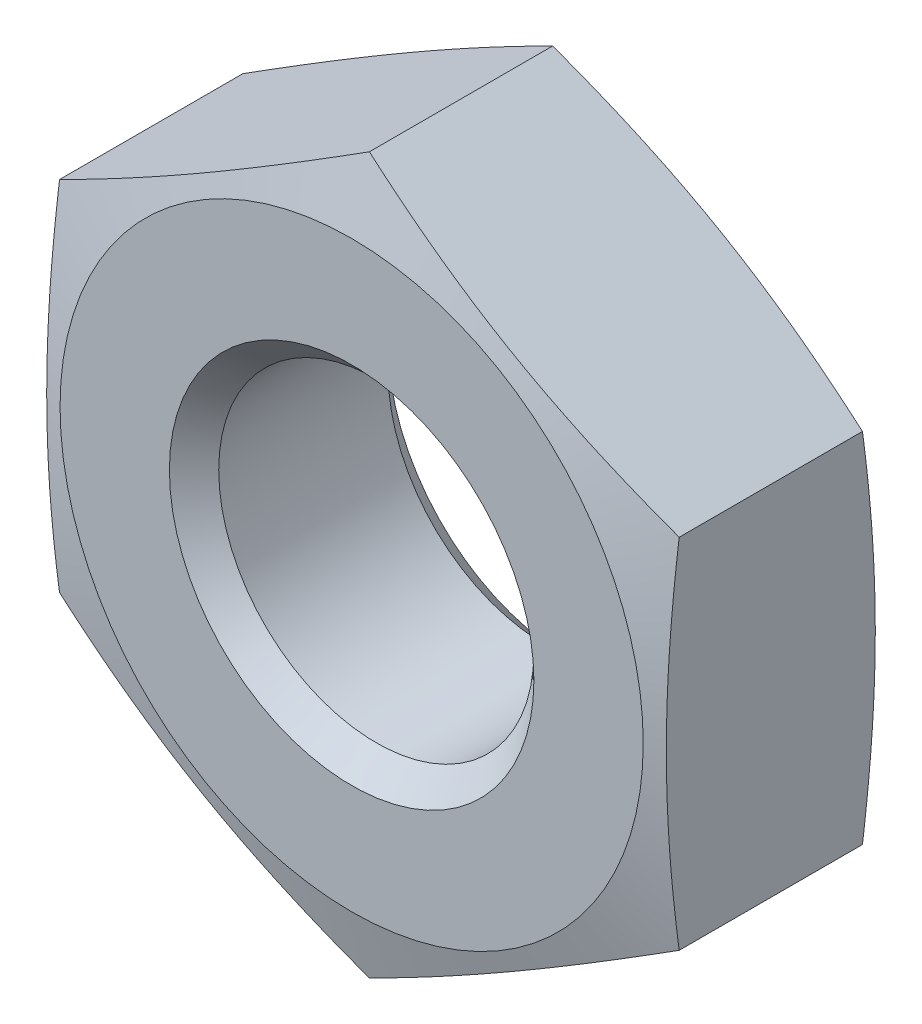
ISO-10303-21;
HEADER;
FILE_DESCRIPTION(('STEP AP214'),'2;1');
FILE_NAME('part.step','',(''),(''),'','','');
FILE_SCHEMA(('AUTOMOTIVE_DESIGN { 1 0 10303 214 1 1 1 1 }'));
ENDSEC;
DATA;
#1=APPLICATION_CONTEXT('core data for automotive mechanical design processes');
#2=APPLICATION_PROTOCOL_DEFINITION('international standard','automotive_design',2000,#1);
#3=PRODUCT_CONTEXT('',#1,'mechanical');
#4=PRODUCT('Part','Part','',(#3));
#5=PRODUCT_RELATED_PRODUCT_CATEGORY('part','',(#4));
#6=PRODUCT_DEFINITION_FORMATION('','',#4);
#7=PRODUCT_DEFINITION_CONTEXT('part definition',#1,'design');
#8=PRODUCT_DEFINITION('design','',#6,#7);
#9=PRODUCT_DEFINITION_SHAPE('','',#8);
#10=(LENGTH_UNIT() NAMED_UNIT(*) SI_UNIT(.MILLI.,.METRE.));
#11=(NAMED_UNIT(*) PLANE_ANGLE_UNIT() SI_UNIT($,.RADIAN.));
#12=(NAMED_UNIT(*) SI_UNIT($,.STERADIAN.) SOLID_ANGLE_UNIT());
#13=UNCERTAINTY_MEASURE_WITH_UNIT(LENGTH_MEASURE(1.E-05),#10,'distance_accuracy_value','');
#14=(GEOMETRIC_REPRESENTATION_CONTEXT(3) GLOBAL_UNCERTAINTY_ASSIGNED_CONTEXT((#13)) GLOBAL_UNIT_ASSIGNED_CONTEXT((#10,
#11,#12)) REPRESENTATION_CONTEXT('',''));
#15=CARTESIAN_POINT('',(0.,0.,0.));
#16=DIRECTION('',(0.,0.,1.));
#17=DIRECTION('',(1.,0.,0.));
#18=AXIS2_PLACEMENT_3D('',#15,#16,#17);
#19=CARTESIAN_POINT('',(-8.,-8.21859166127047,3.));
#20=DIRECTION('',(0.,0.,1.));
#21=DIRECTION('',(1.,0.,0.));
#22=AXIS2_PLACEMENT_3D('',#19,#20,#21);
#23=PLANE('',#22);
#24=CARTESIAN_POINT('',(0.,0.,3.));
#25=DIRECTION('',(0.,0.,1.));
#26=DIRECTION('',(-1.,0.,0.));
#27=AXIS2_PLACEMENT_3D('',#24,#25,#26);
#28=CIRCLE('',#27,7.99999999999999);
#29=CARTESIAN_POINT('',(-7.99999999999999,0.,3.));
#30=VERTEX_POINT('',#29);
#31=EDGE_CURVE('E411',#30,#30,#28,.F.);
#32=ORIENTED_EDGE('',*,*,#31,.F.);
#33=EDGE_LOOP('',(#32));
#34=FACE_BOUND('',#33,.T.);
#35=CARTESIAN_POINT('',(0.,0.,3.));
#36=DIRECTION('',(0.,0.,-1.));
#37=DIRECTION('',(0.99999999999999,-1.42053902152387E-07,0.));
#38=AXIS2_PLACEMENT_3D('',#35,#36,#37);
#39=CIRCLE('',#38,5.);
#40=CARTESIAN_POINT('',(4.99999999999995,-7.10269510761933E-07,3.));
#41=VERTEX_POINT('',#40);
#42=EDGE_CURVE('E414',#41,#41,#39,.T.);
#43=ORIENTED_EDGE('',*,*,#42,.T.);
#44=EDGE_LOOP('',(#43));
#45=FACE_BOUND('',#44,.T.);
#46=ADVANCED_FACE('F17',(#34,#45),#23,.T.);
#47=CARTESIAN_POINT('',(8.,-8.21859166127047,-3.));
#48=DIRECTION('',(0.,0.,-1.));
#49=DIRECTION('',(-1.,0.,0.));
#50=AXIS2_PLACEMENT_3D('',#47,#48,#49);
#51=PLANE('',#50);
#52=CARTESIAN_POINT('',(0.,0.,-3.));
#53=DIRECTION('',(0.,0.,-1.));
#54=DIRECTION('',(1.,0.,0.));
#55=AXIS2_PLACEMENT_3D('',#52,#53,#54);
#56=CIRCLE('',#55,8.);
#57=CARTESIAN_POINT('',(8.,0.,-3.));
#58=VERTEX_POINT('',#57);
#59=EDGE_CURVE('E416',#58,#58,#56,.T.);
#60=ORIENTED_EDGE('',*,*,#59,.T.);
#61=EDGE_LOOP('',(#60));
#62=FACE_BOUND('',#61,.T.);
#63=CARTESIAN_POINT('',(0.,0.,-3.));
#64=DIRECTION('',(0.,0.,1.));
#65=DIRECTION('',(-1.,0.,0.));
#66=AXIS2_PLACEMENT_3D('',#63,#64,#65);
#67=CIRCLE('',#66,5.);
#68=CARTESIAN_POINT('',(-5.,0.,-3.));
#69=VERTEX_POINT('',#68);
#70=EDGE_CURVE('E112',#69,#69,#67,.F.);
#71=ORIENTED_EDGE('',*,*,#70,.F.);
#72=EDGE_LOOP('',(#71));
#73=FACE_BOUND('',#72,.T.);
#74=ADVANCED_FACE('F144',(#62,#73),#51,.T.);
#75=CARTESIAN_POINT('',(-8.5,-4.90747728741786,2.86611114854376));
#76=DIRECTION('',(-1.,0.,0.));
#77=DIRECTION('',(0.,1.,0.));
#78=AXIS2_PLACEMENT_3D('',#75,#76,#77);
#79=PLANE('',#78);
#80=CARTESIAN_POINT('',(-8.5,-8.4273261894037E-05,2.86604445350701));
#81=CARTESIAN_POINT('',(-8.5,1.6544218278601,2.86611114854376));
#82=CARTESIAN_POINT('',(-8.5,3.25140901615558,2.73557322941083));
#83=CARTESIAN_POINT('',(-8.5,4.9074773921886,2.51368437305805));
#84=B_SPLINE_CURVE_WITH_KNOTS('',3,(#80,#81,#82,#83),.UNSPECIFIED.,.F.,.F.,(4,4),(0.,1.),.UNSPECIFIED.);
#85=CARTESIAN_POINT('',(-8.49998290282996,-8.42732571968421E-05,2.86604268473507));
#86=VERTEX_POINT('',#85);
#87=CARTESIAN_POINT('',(-8.5,4.9074773921886,2.51368437305805));
#88=VERTEX_POINT('',#87);
#89=EDGE_CURVE('E91',#86,#88,#84,.T.);
#90=ORIENTED_EDGE('',*,*,#89,.T.);
#91=DIRECTION('',(0.,-2.08400745274225E-08,-1.));
#92=VECTOR('',#91,1.);
#93=CARTESIAN_POINT('',(-8.5,4.9074773921886,2.51368437305805));
#94=LINE('',#93,#92);
#95=CARTESIAN_POINT('',(-8.5,4.90747728741786,-2.51368438714887));
#96=VERTEX_POINT('',#95);
#97=EDGE_CURVE('E109',#88,#96,#94,.T.);
#98=ORIENTED_EDGE('',*,*,#97,.T.);
#99=CARTESIAN_POINT('',(-8.5,4.90747728741786,-2.51368438714887));
#100=CARTESIAN_POINT('',(-8.5,3.26708967210256,-2.73347225583481));
#101=CARTESIAN_POINT('',(-8.5,1.66858320881791,-2.86594224871391));
#102=CARTESIAN_POINT('',(-8.5,8.42732954895592E-05,-2.86604443192364));
#103=B_SPLINE_CURVE_WITH_KNOTS('',3,(#99,#100,#101,#102),.UNSPECIFIED.,.F.,.F.,(4,4),(0.,1.),.UNSPECIFIED.);
#104=CARTESIAN_POINT('',(-8.49998291715431,8.42732907993195E-05,-2.86604266650797));
#105=VERTEX_POINT('',#104);
#106=EDGE_CURVE('E119',#96,#105,#103,.T.);
#107=ORIENTED_EDGE('',*,*,#106,.T.);
#108=CARTESIAN_POINT('',(-8.5,8.42732954895592E-05,-2.86604443192364));
#109=CARTESIAN_POINT('',(-8.5,-1.65442177364285,-2.86611114161511));
#110=CARTESIAN_POINT('',(-8.5,-3.25140890912646,-2.73557323676254));
#111=CARTESIAN_POINT('',(-8.5,-4.90747722951565,-2.5136843954543));
#112=B_SPLINE_CURVE_WITH_KNOTS('',3,(#108,#109,#110,#111),.UNSPECIFIED.,.F.,.F.,(4,4),(0.,1.),.UNSPECIFIED.);
#113=CARTESIAN_POINT('',(-8.5,-4.90747722951565,-2.5136843954543));
#114=VERTEX_POINT('',#113);
#115=EDGE_CURVE('E121',#105,#114,#112,.T.);
#116=ORIENTED_EDGE('',*,*,#115,.T.);
#117=DIRECTION('',(0.,-1.15173982385563E-08,1.));
#118=VECTOR('',#117,1.);
#119=CARTESIAN_POINT('',(-8.5,-4.90747722951565,-2.5136843954543));
#120=LINE('',#119,#118);
#121=CARTESIAN_POINT('',(-8.5,-4.90747728741786,2.51368438714887));
#122=VERTEX_POINT('',#121);
#123=EDGE_CURVE('E157',#122,#114,#120,.F.);
#124=ORIENTED_EDGE('',*,*,#123,.F.);
#125=CARTESIAN_POINT('',(-8.5,-4.90747728741786,2.51368438714887));
#126=CARTESIAN_POINT('',(-8.5,-3.26708967209083,2.7334722631518));
#127=CARTESIAN_POINT('',(-8.5,-1.66858320879657,2.86594226304824));
#128=CARTESIAN_POINT('',(-8.5,-8.4273261894037E-05,2.86604445350701));
#129=B_SPLINE_CURVE_WITH_KNOTS('',3,(#125,#126,#127,#128),.UNSPECIFIED.,.F.,.F.,(4,4),(0.,1.),.UNSPECIFIED.);
#130=EDGE_CURVE('E102',#122,#86,#129,.T.);
#131=ORIENTED_EDGE('',*,*,#130,.T.);
#132=EDGE_LOOP('',(#90,#98,#107,#116,#124,#131));
#133=FACE_BOUND('',#132,.T.);
#134=ADVANCED_FACE('F108',(#133),#79,.T.);
#135=CARTESIAN_POINT('',(-8.50000000048205,4.90747728783349,-2.98347240947657));
#136=DIRECTION('',(-0.500000000000006,0.866025403784435,0.));
#137=DIRECTION('',(0.,0.,1.));
#138=AXIS2_PLACEMENT_3D('',#135,#136,#137);
#139=PLANE('',#138);
#140=CARTESIAN_POINT('',(-8.49999995493342,4.90747731413101,2.51368437305805));
#141=CARTESIAN_POINT('',(-5.46324240485116,6.66075010313466,2.98347239283319));
#142=CARTESIAN_POINT('',(-3.03675740531011,8.06168187080429,2.98347239079958));
#143=CARTESIAN_POINT('',(1.44772150864614E-07,9.81495465980794,2.51368436581218));
#144=B_SPLINE_CURVE_WITH_KNOTS('',3,(#140,#141,#142,#143),.UNSPECIFIED.,.F.,.F.,(4,4),(0.,1.),.UNSPECIFIED.);
#145=CARTESIAN_POINT('',(1.44772153376493E-07,9.81495465980794,2.51368436581218));
#146=VERTEX_POINT('',#145);
#147=EDGE_CURVE('E87',#88,#146,#144,.T.);
#148=ORIENTED_EDGE('',*,*,#147,.T.);
#149=DIRECTION('',(-2.87966628174586E-08,-1.6625761013644E-08,-0.999999999999999));
#150=VECTOR('',#149,1.);
#151=CARTESIAN_POINT('',(1.44772153376493E-07,9.81495465980794,2.51368436581218));
#152=LINE('',#151,#150);
#153=CARTESIAN_POINT('',(7.105427357601E-13,9.81495457622411,-2.51368438699992));
#154=VERTEX_POINT('',#153);
#155=EDGE_CURVE('E101',#146,#154,#152,.T.);
#156=ORIENTED_EDGE('',*,*,#155,.T.);
#157=CARTESIAN_POINT('',(7.09501901674514E-13,9.81495457622411,-2.51368438699992));
#158=CARTESIAN_POINT('',(-3.03675751439393,8.06168180782472,-2.98347240943476));
#159=CARTESIAN_POINT('',(-5.46324248608741,6.66075005623288,-2.98347240947657));
#160=CARTESIAN_POINT('',(-8.50000000048205,4.90747728783349,-2.51368438714887));
#161=B_SPLINE_CURVE_WITH_KNOTS('',3,(#157,#158,#159,#160),.UNSPECIFIED.,.F.,.F.,(4,4),(0.,1.),.UNSPECIFIED.);
#162=EDGE_CURVE('E117',#154,#96,#161,.T.);
#163=ORIENTED_EDGE('',*,*,#162,.T.);
#164=ORIENTED_EDGE('',*,*,#97,.F.);
#165=EDGE_LOOP('',(#148,#156,#163,#164));
#166=FACE_BOUND('',#165,.T.);
#167=ADVANCED_FACE('F116',(#166),#139,.T.);
#168=CARTESIAN_POINT('',(-2.83720571327396E-12,9.81495457622534,-2.98347241453508));
#169=DIRECTION('',(0.500000000000006,0.866025403784435,0.));
#170=DIRECTION('',(0.,0.,1.));
#171=AXIS2_PLACEMENT_3D('',#168,#169,#170);
#172=PLANE('',#171);
#173=CARTESIAN_POINT('',(7.43363479614467E-08,9.81495453330559,2.51368436581218));
#174=CARTESIAN_POINT('',(3.03675761389671,8.06168175037676,2.98347238819345));
#175=CARTESIAN_POINT('',(5.46324260522734,6.66074998744741,2.98347238819346));
#176=CARTESIAN_POINT('',(8.5000001447877,4.90747720451858,2.5136843658122));
#177=B_SPLINE_CURVE_WITH_KNOTS('',3,(#173,#174,#175,#176),.UNSPECIFIED.,.F.,.F.,(4,4),(0.,1.),.UNSPECIFIED.);
#178=CARTESIAN_POINT('',(8.5000001447877,4.90747720451858,2.5136843658122));
#179=VERTEX_POINT('',#178);
#180=EDGE_CURVE('E94',#146,#179,#177,.T.);
#181=ORIENTED_EDGE('',*,*,#180,.T.);
#182=DIRECTION('',(-2.36252532172083E-08,1.36400464238891E-08,-1.));
#183=VECTOR('',#182,1.);
#184=CARTESIAN_POINT('',(8.5000001447877,4.90747720451858,2.5136843658122));
#185=LINE('',#184,#183);
#186=CARTESIAN_POINT('',(8.50000002601484,4.90747727309213,-2.51368439504874));
#187=VERTEX_POINT('',#186);
#188=EDGE_CURVE('E269',#179,#187,#185,.T.);
#189=ORIENTED_EDGE('',*,*,#188,.T.);
#190=CARTESIAN_POINT('',(8.50000002601484,4.90747727309212,-2.51368439504874));
#191=CARTESIAN_POINT('',(5.46324250243679,6.66075004679356,-2.98347241453508));
#192=CARTESIAN_POINT('',(3.03675752357735,8.06168180252267,-2.98347241227612));
#193=CARTESIAN_POINT('',(-7.09540919860193E-13,9.81495457622411,-2.51368438699992));
#194=B_SPLINE_CURVE_WITH_KNOTS('',3,(#190,#191,#192,#193),.UNSPECIFIED.,.F.,.F.,(4,4),(0.,1.),.UNSPECIFIED.);
#195=EDGE_CURVE('E203',#187,#154,#194,.T.);
#196=ORIENTED_EDGE('',*,*,#195,.T.);
#197=ORIENTED_EDGE('',*,*,#155,.F.);
#198=EDGE_LOOP('',(#181,#189,#196,#197));
#199=FACE_BOUND('',#198,.T.);
#200=ADVANCED_FACE('F249',(#199),#172,.T.);
#201=CARTESIAN_POINT('',(8.5,-4.90747728741786,-2.86611115581972));
#202=DIRECTION('',(1.,0.,0.));
#203=DIRECTION('',(0.,1.,0.));
#204=AXIS2_PLACEMENT_3D('',#201,#202,#203);
#205=PLANE('',#204);
#206=CARTESIAN_POINT('',(8.5,8.42729222351804E-05,2.86604443192365));
#207=CARTESIAN_POINT('',(8.5,-1.65442177388016,2.86611114157635));
#208=CARTESIAN_POINT('',(8.5,-3.25140890926466,2.7355732367269));
#209=CARTESIAN_POINT('',(8.5,-4.90747722951565,2.5136843954543));
#210=B_SPLINE_CURVE_WITH_KNOTS('',3,(#206,#207,#208,#209),.UNSPECIFIED.,.F.,.F.,(4,4),(0.,1.),.UNSPECIFIED.);
#211=CARTESIAN_POINT('',(8.4999829171543,8.42729175446431E-05,2.86604266650797));
#212=VERTEX_POINT('',#211);
#213=CARTESIAN_POINT('',(8.5,-4.90747722951565,2.5136843954543));
#214=VERTEX_POINT('',#213);
#215=EDGE_CURVE('E224',#212,#214,#210,.T.);
#216=ORIENTED_EDGE('',*,*,#215,.T.);
#217=DIRECTION('',(0.,-1.15173971785444E-08,-1.));
#218=VECTOR('',#217,1.);
#219=CARTESIAN_POINT('',(8.5,-4.90747722951565,2.5136843954543));
#220=LINE('',#219,#218);
#221=CARTESIAN_POINT('',(8.5,-4.90747728741786,-2.51368438714887));
#222=VERTEX_POINT('',#221);
#223=EDGE_CURVE('E221',#214,#222,#220,.T.);
#224=ORIENTED_EDGE('',*,*,#223,.T.);
#225=CARTESIAN_POINT('',(8.5,-4.90747728741786,-2.51368438714887));
#226=CARTESIAN_POINT('',(8.5,-3.26708967192,-2.7334722631967));
#227=CARTESIAN_POINT('',(8.5,-1.66858320849307,-2.86594226309907));
#228=CARTESIAN_POINT('',(8.5,-8.42727766719314E-05,-2.86604445350702));
#229=B_SPLINE_CURVE_WITH_KNOTS('',3,(#225,#226,#227,#228),.UNSPECIFIED.,.F.,.F.,(4,4),(0.,1.),.UNSPECIFIED.);
#230=CARTESIAN_POINT('',(8.49998290282996,-8.42727719739569E-05,-2.86604268473508));
#231=VERTEX_POINT('',#230);
#232=EDGE_CURVE('E213',#222,#231,#229,.T.);
#233=ORIENTED_EDGE('',*,*,#232,.T.);
#234=CARTESIAN_POINT('',(8.5,-8.42727766719314E-05,-2.86604445350702));
#235=CARTESIAN_POINT('',(8.5,1.6544217809856,-2.86611115581972));
#236=CARTESIAN_POINT('',(8.5,3.25140892316558,-2.73557324383143));
#237=CARTESIAN_POINT('',(8.5,4.90747725056445,-2.51368439504874));
#238=B_SPLINE_CURVE_WITH_KNOTS('',3,(#234,#235,#236,#237),.UNSPECIFIED.,.F.,.F.,(4,4),(0.,1.),.UNSPECIFIED.);
#239=EDGE_CURVE('E212',#231,#187,#238,.T.);
#240=ORIENTED_EDGE('',*,*,#239,.T.);
#241=ORIENTED_EDGE('',*,*,#188,.F.);
#242=CARTESIAN_POINT('',(8.5,4.90747720226211,2.5136843658122));
#243=CARTESIAN_POINT('',(8.5,3.26708961567493,2.73347224176376));
#244=CARTESIAN_POINT('',(8.5,1.66858317997351,2.86594224158426));
#245=CARTESIAN_POINT('',(8.5,8.42729222351804E-05,2.86604443192365));
#246=B_SPLINE_CURVE_WITH_KNOTS('',3,(#242,#243,#244,#245),.UNSPECIFIED.,.F.,.F.,(4,4),(0.,1.),.UNSPECIFIED.);
#247=EDGE_CURVE('E219',#179,#212,#246,.T.);
#248=ORIENTED_EDGE('',*,*,#247,.T.);
#249=EDGE_LOOP('',(#216,#224,#233,#240,#241,#248));
#250=FACE_BOUND('',#249,.T.);
#251=ADVANCED_FACE('F239',(#250),#205,.T.);
#252=CARTESIAN_POINT('',(8.50000002439968,-4.90747727402463,-2.98347240947657));
#253=DIRECTION('',(0.499999999999999,-0.866025403784439,0.));
#254=DIRECTION('',(0.,0.,1.));
#255=AXIS2_PLACEMENT_3D('',#252,#253,#254);
#256=PLANE('',#255);
#257=CARTESIAN_POINT('',(8.50000002439968,-4.90747727402463,2.5136843954543));
#258=CARTESIAN_POINT('',(5.46324250093592,-6.66075004766005,2.98347241494065));
#259=CARTESIAN_POINT('',(3.03675752216569,-8.06168180333762,2.9834724126817));
#260=CARTESIAN_POINT('',(-1.29807969928564E-09,-9.81495457697305,2.51368438740551));
#261=B_SPLINE_CURVE_WITH_KNOTS('',3,(#257,#258,#259,#260),.UNSPECIFIED.,.F.,.F.,(4,4),(0.,1.),.UNSPECIFIED.);
#262=CARTESIAN_POINT('',(-1.29808164217593E-09,-9.81495457697305,2.51368438740551));
#263=VERTEX_POINT('',#262);
#264=EDGE_CURVE('E220',#214,#263,#261,.T.);
#265=ORIENTED_EDGE('',*,*,#264,.T.);
#266=DIRECTION('',(2.58060593639876E-10,1.48991026791108E-10,-1.));
#267=VECTOR('',#266,1.);
#268=CARTESIAN_POINT('',(-1.29808164217593E-09,-9.81495457697305,2.51368438740551));
#269=LINE('',#268,#267);
#270=CARTESIAN_POINT('',(-7.15871806278301E-13,-9.81495457622402,-2.51368438699995));
#271=VERTEX_POINT('',#270);
#272=EDGE_CURVE('E359',#263,#271,#269,.T.);
#273=ORIENTED_EDGE('',*,*,#272,.T.);
#274=CARTESIAN_POINT('',(-7.14706072102445E-13,-9.81495457622401,-2.51368438699995));
#275=CARTESIAN_POINT('',(3.03675751439393,-8.06168180782465,-2.98347240943478));
#276=CARTESIAN_POINT('',(5.46324248608742,-6.66075005623284,-2.98347240947657));
#277=CARTESIAN_POINT('',(8.50000000048205,-4.90747728783348,-2.51368438714887));
#278=B_SPLINE_CURVE_WITH_KNOTS('',3,(#274,#275,#276,#277),.UNSPECIFIED.,.F.,.F.,(4,4),(0.,1.),.UNSPECIFIED.);
#279=EDGE_CURVE('E36',#271,#222,#278,.T.);
#280=ORIENTED_EDGE('',*,*,#279,.T.);
#281=ORIENTED_EDGE('',*,*,#223,.F.);
#282=EDGE_LOOP('',(#265,#273,#280,#281));
#283=FACE_BOUND('',#282,.T.);
#284=ADVANCED_FACE('F248',(#283),#256,.T.);
#285=CARTESIAN_POINT('',(7.0275654115758E-13,-9.81495457622402,-2.98347241479478));
#286=DIRECTION('',(-0.499999999999999,-0.866025403784439,0.));
#287=DIRECTION('',(0.,0.,1.));
#288=AXIS2_PLACEMENT_3D('',#285,#286,#287);
#289=PLANE('',#288);
#290=CARTESIAN_POINT('',(-1.62611998000955E-09,-9.81495457528477,2.51368438740551));
#291=CARTESIAN_POINT('',(-3.03675751543564,-8.06168180722323,2.98347240969447));
#292=CARTESIAN_POINT('',(-5.46324248667254,-6.66075005589502,2.98347240962244));
#293=CARTESIAN_POINT('',(-8.50000000048205,-4.90747728783349,2.51368438714887));
#294=B_SPLINE_CURVE_WITH_KNOTS('',3,(#290,#291,#292,#293),.UNSPECIFIED.,.F.,.F.,(4,4),(0.,1.),.UNSPECIFIED.);
#295=EDGE_CURVE('E45',#263,#122,#294,.T.);
#296=ORIENTED_EDGE('',*,*,#295,.T.);
#297=ORIENTED_EDGE('',*,*,#123,.T.);
#298=CARTESIAN_POINT('',(-8.50000002439969,-4.90747727402463,-2.5136843954543));
#299=CARTESIAN_POINT('',(-5.46324250140256,-6.66075004739065,-2.98347241479478));
#300=CARTESIAN_POINT('',(-3.03675752299643,-8.061681802858,-2.98347241242201));
#301=CARTESIAN_POINT('',(7.0275654115758E-13,-9.81495457622402,-2.51368438699995));
#302=B_SPLINE_CURVE_WITH_KNOTS('',3,(#298,#299,#300,#301),.UNSPECIFIED.,.F.,.F.,(4,4),(0.,1.),.UNSPECIFIED.);
#303=EDGE_CURVE('E169',#114,#271,#302,.T.);
#304=ORIENTED_EDGE('',*,*,#303,.T.);
#305=ORIENTED_EDGE('',*,*,#272,.F.);
#306=EDGE_LOOP('',(#296,#297,#304,#305));
#307=FACE_BOUND('',#306,.T.);
#308=ADVANCED_FACE('F290',(#307),#289,.T.);
#309=CARTESIAN_POINT('',(0.,0.,2.51368438704588));
#310=DIRECTION('',(0.,0.,-1.));
#311=DIRECTION('',(0.999999999950851,9.9145800817757E-06,0.));
#312=AXIS2_PLACEMENT_3D('',#309,#310,#311);
#313=CONICAL_SURFACE('',#312,9.81495457605872,1.30899693899574);
#314=ORIENTED_EDGE('',*,*,#31,.T.);
#315=EDGE_LOOP('',(#314));
#316=FACE_BOUND('',#315,.T.);
#317=ORIENTED_EDGE('',*,*,#130,.F.);
#318=ORIENTED_EDGE('',*,*,#295,.F.);
#319=ORIENTED_EDGE('',*,*,#264,.F.);
#320=ORIENTED_EDGE('',*,*,#215,.F.);
#321=ORIENTED_EDGE('',*,*,#247,.F.);
#322=ORIENTED_EDGE('',*,*,#180,.F.);
#323=ORIENTED_EDGE('',*,*,#147,.F.);
#324=ORIENTED_EDGE('',*,*,#89,.F.);
#325=EDGE_LOOP('',(#317,#318,#319,#320,#321,#322,#323,#324));
#326=FACE_BOUND('',#325,.T.);
#327=ADVANCED_FACE('F90',(#316,#326),#313,.T.);
#328=CARTESIAN_POINT('',(0.,0.,3.));
#329=DIRECTION('',(0.,0.,1.));
#330=DIRECTION('',(-1.,0.,0.));
#331=AXIS2_PLACEMENT_3D('',#328,#329,#330);
#332=CONICAL_SURFACE('',#331,5.,0.785398163397448);
#333=ORIENTED_EDGE('',*,*,#42,.F.);
#334=EDGE_LOOP('',(#333));
#335=FACE_BOUND('',#334,.T.);
#336=CARTESIAN_POINT('',(0.,0.,2.3235));
#337=DIRECTION('',(0.,0.,-1.));
#338=DIRECTION('',(1.,0.,0.));
#339=AXIS2_PLACEMENT_3D('',#336,#337,#338);
#340=CIRCLE('',#339,4.3235);
#341=CARTESIAN_POINT('',(4.3235,0.,2.3235));
#342=VERTEX_POINT('',#341);
#343=EDGE_CURVE('E28',#342,#342,#340,.T.);
#344=ORIENTED_EDGE('',*,*,#343,.T.);
#345=EDGE_LOOP('',(#344));
#346=FACE_BOUND('',#345,.T.);
#347=ADVANCED_FACE('F289',(#335,#346),#332,.F.);
#348=CARTESIAN_POINT('',(0.,0.,-3.));
#349=DIRECTION('',(0.,0.,-1.));
#350=DIRECTION('',(1.,0.,0.));
#351=AXIS2_PLACEMENT_3D('',#348,#349,#350);
#352=CYLINDRICAL_SURFACE('',#351,4.3235);
#353=CARTESIAN_POINT('',(0.,0.,-2.3235));
#354=DIRECTION('',(0.,0.,-1.));
#355=DIRECTION('',(1.,0.,0.));
#356=AXIS2_PLACEMENT_3D('',#353,#354,#355);
#357=CIRCLE('',#356,4.3235);
#358=CARTESIAN_POINT('',(4.3235,0.,-2.3235));
#359=VERTEX_POINT('',#358);
#360=EDGE_CURVE('E11',#359,#359,#357,.T.);
#361=ORIENTED_EDGE('',*,*,#360,.T.);
#362=EDGE_LOOP('',(#361));
#363=FACE_BOUND('',#362,.T.);
#364=ORIENTED_EDGE('',*,*,#343,.F.);
#365=EDGE_LOOP('',(#364));
#366=FACE_BOUND('',#365,.T.);
#367=ADVANCED_FACE('F428',(#363,#366),#352,.F.);
#368=CARTESIAN_POINT('',(0.,0.,-3.));
#369=DIRECTION('',(0.,0.,-1.));
#370=DIRECTION('',(1.,0.,0.));
#371=AXIS2_PLACEMENT_3D('',#368,#369,#370);
#372=CONICAL_SURFACE('',#371,5.,0.785398163397448);
#373=ORIENTED_EDGE('',*,*,#70,.T.);
#374=EDGE_LOOP('',(#373));
#375=FACE_BOUND('',#374,.T.);
#376=ORIENTED_EDGE('',*,*,#360,.F.);
#377=EDGE_LOOP('',(#376));
#378=FACE_BOUND('',#377,.T.);
#379=ADVANCED_FACE('F424',(#375,#378),#372,.F.);
#380=CARTESIAN_POINT('',(0.,0.,-2.51368438699995));
#381=DIRECTION('',(0.,0.,1.));
#382=DIRECTION('',(-0.99999999995085,9.91462399464904E-06,0.));
#383=AXIS2_PLACEMENT_3D('',#380,#381,#382);
#384=CONICAL_SURFACE('',#383,9.81495457623016,1.30899693899574);
#385=ORIENTED_EDGE('',*,*,#59,.F.);
#386=EDGE_LOOP('',(#385));
#387=FACE_BOUND('',#386,.T.);
#388=ORIENTED_EDGE('',*,*,#232,.F.);
#389=ORIENTED_EDGE('',*,*,#279,.F.);
#390=ORIENTED_EDGE('',*,*,#303,.F.);
#391=ORIENTED_EDGE('',*,*,#115,.F.);
#392=ORIENTED_EDGE('',*,*,#106,.F.);
#393=ORIENTED_EDGE('',*,*,#162,.F.);
#394=ORIENTED_EDGE('',*,*,#195,.F.);
#395=ORIENTED_EDGE('',*,*,#239,.F.);
#396=EDGE_LOOP('',(#388,#389,#390,#391,#392,#393,#394,#395));
#397=FACE_BOUND('',#396,.T.);
#398=ADVANCED_FACE('F19',(#387,#397),#384,.T.);
#399=CLOSED_SHELL('',(#46,#74,#134,#167,#200,#251,#284,#308,#327,#347,#367,#379,#398));
#400=MANIFOLD_SOLID_BREP('B1',#399);
#401=ADVANCED_BREP_SHAPE_REPRESENTATION('',(#18,#400),#14);
#402=SHAPE_DEFINITION_REPRESENTATION(#9,#401);
ENDSEC;
END-ISO-10303-21;
